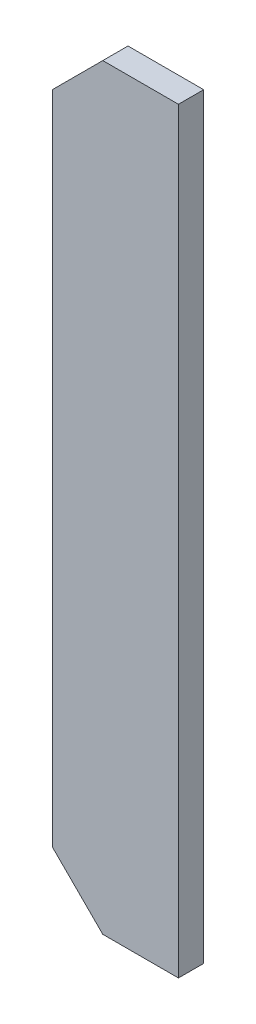
ISO-10303-21;
HEADER;
FILE_DESCRIPTION(('STEP AP214'),'2;1');
FILE_NAME('part.step','',(''),(''),'','','');
FILE_SCHEMA(('AUTOMOTIVE_DESIGN { 1 0 10303 214 1 1 1 1 }'));
ENDSEC;
DATA;
#1=APPLICATION_CONTEXT('core data for automotive mechanical design processes');
#2=APPLICATION_PROTOCOL_DEFINITION('international standard','automotive_design',2000,#1);
#3=PRODUCT_CONTEXT('',#1,'mechanical');
#4=PRODUCT('Part','Part','',(#3));
#5=PRODUCT_RELATED_PRODUCT_CATEGORY('part','',(#4));
#6=PRODUCT_DEFINITION_FORMATION('','',#4);
#7=PRODUCT_DEFINITION_CONTEXT('part definition',#1,'design');
#8=PRODUCT_DEFINITION('design','',#6,#7);
#9=PRODUCT_DEFINITION_SHAPE('','',#8);
#10=(LENGTH_UNIT() NAMED_UNIT(*) SI_UNIT(.MILLI.,.METRE.));
#11=(NAMED_UNIT(*) PLANE_ANGLE_UNIT() SI_UNIT($,.RADIAN.));
#12=(NAMED_UNIT(*) SI_UNIT($,.STERADIAN.) SOLID_ANGLE_UNIT());
#13=UNCERTAINTY_MEASURE_WITH_UNIT(LENGTH_MEASURE(1.E-05),#10,'distance_accuracy_value','');
#14=(GEOMETRIC_REPRESENTATION_CONTEXT(3) GLOBAL_UNCERTAINTY_ASSIGNED_CONTEXT((#13)) GLOBAL_UNIT_ASSIGNED_CONTEXT((#10,
#11,#12)) REPRESENTATION_CONTEXT('',''));
#15=CARTESIAN_POINT('',(0.,0.,0.));
#16=DIRECTION('',(0.,0.,1.));
#17=DIRECTION('',(1.,0.,0.));
#18=AXIS2_PLACEMENT_3D('',#15,#16,#17);
#19=CARTESIAN_POINT('',(25.,0.,2.5));
#20=DIRECTION('',(0.,1.,0.));
#21=DIRECTION('',(-1.,0.,0.));
#22=AXIS2_PLACEMENT_3D('',#19,#20,#21);
#23=PLANE('',#22);
#24=DIRECTION('',(1.,0.,0.));
#25=VECTOR('',#24,1.);
#26=CARTESIAN_POINT('',(25.,0.,2.5));
#27=LINE('',#26,#25);
#28=CARTESIAN_POINT('',(9.99999999999998,0.,2.5));
#29=VERTEX_POINT('',#28);
#30=CARTESIAN_POINT('',(25.,0.,2.5));
#31=VERTEX_POINT('',#30);
#32=EDGE_CURVE('E101',#29,#31,#27,.T.);
#33=ORIENTED_EDGE('',*,*,#32,.F.);
#34=DIRECTION('',(0.,0.,-1.));
#35=VECTOR('',#34,1.);
#36=CARTESIAN_POINT('',(9.99999999999998,0.,2.5));
#37=LINE('',#36,#35);
#38=CARTESIAN_POINT('',(9.99999999999998,0.,-2.5));
#39=VERTEX_POINT('',#38);
#40=EDGE_CURVE('E127',#29,#39,#37,.T.);
#41=ORIENTED_EDGE('',*,*,#40,.T.);
#42=DIRECTION('',(1.,0.,0.));
#43=VECTOR('',#42,1.);
#44=CARTESIAN_POINT('',(25.,0.,-2.5));
#45=LINE('',#44,#43);
#46=CARTESIAN_POINT('',(25.,0.,-2.5));
#47=VERTEX_POINT('',#46);
#48=EDGE_CURVE('E124',#39,#47,#45,.T.);
#49=ORIENTED_EDGE('',*,*,#48,.T.);
#50=DIRECTION('',(0.,0.,-1.));
#51=VECTOR('',#50,1.);
#52=CARTESIAN_POINT('',(25.,0.,2.5));
#53=LINE('',#52,#51);
#54=EDGE_CURVE('E117',#31,#47,#53,.T.);
#55=ORIENTED_EDGE('',*,*,#54,.F.);
#56=EDGE_LOOP('',(#33,#41,#49,#55));
#57=FACE_BOUND('',#56,.T.);
#58=ADVANCED_FACE('F45',(#57),#23,.F.);
#59=CARTESIAN_POINT('',(25.,150.,2.5));
#60=DIRECTION('',(-1.,0.,0.));
#61=DIRECTION('',(0.,0.,1.));
#62=AXIS2_PLACEMENT_3D('',#59,#60,#61);
#63=PLANE('',#62);
#64=DIRECTION('',(0.,1.,0.));
#65=VECTOR('',#64,1.);
#66=CARTESIAN_POINT('',(25.,150.,-2.5));
#67=LINE('',#66,#65);
#68=CARTESIAN_POINT('',(25.,150.,-2.5));
#69=VERTEX_POINT('',#68);
#70=EDGE_CURVE('E173',#47,#69,#67,.T.);
#71=ORIENTED_EDGE('',*,*,#70,.T.);
#72=DIRECTION('',(0.,0.,-1.));
#73=VECTOR('',#72,1.);
#74=CARTESIAN_POINT('',(25.,150.,2.5));
#75=LINE('',#74,#73);
#76=CARTESIAN_POINT('',(25.,150.,2.5));
#77=VERTEX_POINT('',#76);
#78=EDGE_CURVE('E119',#77,#69,#75,.T.);
#79=ORIENTED_EDGE('',*,*,#78,.F.);
#80=DIRECTION('',(0.,1.,0.));
#81=VECTOR('',#80,1.);
#82=CARTESIAN_POINT('',(25.,150.,2.5));
#83=LINE('',#82,#81);
#84=EDGE_CURVE('E104',#31,#77,#83,.T.);
#85=ORIENTED_EDGE('',*,*,#84,.F.);
#86=ORIENTED_EDGE('',*,*,#54,.T.);
#87=EDGE_LOOP('',(#71,#79,#85,#86));
#88=FACE_BOUND('',#87,.T.);
#89=ADVANCED_FACE('F116',(#88),#63,.F.);
#90=CARTESIAN_POINT('',(0.,150.,2.5));
#91=DIRECTION('',(0.,-1.,0.));
#92=DIRECTION('',(0.,0.,-1.));
#93=AXIS2_PLACEMENT_3D('',#90,#91,#92);
#94=PLANE('',#93);
#95=DIRECTION('',(-1.,0.,0.));
#96=VECTOR('',#95,1.);
#97=CARTESIAN_POINT('',(0.,150.,-2.5));
#98=LINE('',#97,#96);
#99=CARTESIAN_POINT('',(10.,150.,-2.5));
#100=VERTEX_POINT('',#99);
#101=EDGE_CURVE('E170',#69,#100,#98,.T.);
#102=ORIENTED_EDGE('',*,*,#101,.T.);
#103=DIRECTION('',(0.,0.,1.));
#104=VECTOR('',#103,1.);
#105=CARTESIAN_POINT('',(10.,150.,2.5));
#106=LINE('',#105,#104);
#107=CARTESIAN_POINT('',(10.,150.,2.5));
#108=VERTEX_POINT('',#107);
#109=EDGE_CURVE('E11',#100,#108,#106,.T.);
#110=ORIENTED_EDGE('',*,*,#109,.T.);
#111=DIRECTION('',(-1.,0.,0.));
#112=VECTOR('',#111,1.);
#113=CARTESIAN_POINT('',(0.,150.,2.5));
#114=LINE('',#113,#112);
#115=EDGE_CURVE('E121',#77,#108,#114,.T.);
#116=ORIENTED_EDGE('',*,*,#115,.F.);
#117=ORIENTED_EDGE('',*,*,#78,.T.);
#118=EDGE_LOOP('',(#102,#110,#116,#117));
#119=FACE_BOUND('',#118,.T.);
#120=ADVANCED_FACE('F171',(#119),#94,.F.);
#121=CARTESIAN_POINT('',(0.,0.,2.5));
#122=DIRECTION('',(1.,0.,0.));
#123=DIRECTION('',(0.,0.,-1.));
#124=AXIS2_PLACEMENT_3D('',#121,#122,#123);
#125=PLANE('',#124);
#126=DIRECTION('',(0.,-1.,0.));
#127=VECTOR('',#126,1.);
#128=CARTESIAN_POINT('',(0.,0.,-2.5));
#129=LINE('',#128,#127);
#130=CARTESIAN_POINT('',(0.,140.,-2.5));
#131=VERTEX_POINT('',#130);
#132=CARTESIAN_POINT('',(0.,10.,-2.5));
#133=VERTEX_POINT('',#132);
#134=EDGE_CURVE('E112',#131,#133,#129,.T.);
#135=ORIENTED_EDGE('',*,*,#134,.T.);
#136=DIRECTION('',(0.,0.,1.));
#137=VECTOR('',#136,1.);
#138=CARTESIAN_POINT('',(0.,10.,2.5));
#139=LINE('',#138,#137);
#140=CARTESIAN_POINT('',(0.,10.,2.5));
#141=VERTEX_POINT('',#140);
#142=EDGE_CURVE('E68',#133,#141,#139,.T.);
#143=ORIENTED_EDGE('',*,*,#142,.T.);
#144=DIRECTION('',(0.,-1.,0.));
#145=VECTOR('',#144,1.);
#146=CARTESIAN_POINT('',(0.,0.,2.5));
#147=LINE('',#146,#145);
#148=CARTESIAN_POINT('',(0.,140.,2.5));
#149=VERTEX_POINT('',#148);
#150=EDGE_CURVE('E134',#149,#141,#147,.T.);
#151=ORIENTED_EDGE('',*,*,#150,.F.);
#152=DIRECTION('',(0.,0.,-1.));
#153=VECTOR('',#152,1.);
#154=CARTESIAN_POINT('',(0.,140.,2.5));
#155=LINE('',#154,#153);
#156=EDGE_CURVE('E143',#149,#131,#155,.T.);
#157=ORIENTED_EDGE('',*,*,#156,.T.);
#158=EDGE_LOOP('',(#135,#143,#151,#157));
#159=FACE_BOUND('',#158,.T.);
#160=ADVANCED_FACE('F163',(#159),#125,.F.);
#161=CARTESIAN_POINT('',(0.,0.,2.5));
#162=DIRECTION('',(0.,0.,-1.));
#163=DIRECTION('',(-1.,0.,0.));
#164=AXIS2_PLACEMENT_3D('',#161,#162,#163);
#165=PLANE('',#164);
#166=ORIENTED_EDGE('',*,*,#150,.T.);
#167=DIRECTION('',(-0.707106781186546,0.707106781186549,0.));
#168=VECTOR('',#167,1.);
#169=CARTESIAN_POINT('',(9.99999999999998,0.,2.5));
#170=LINE('',#169,#168);
#171=EDGE_CURVE('E55',#141,#29,#170,.F.);
#172=ORIENTED_EDGE('',*,*,#171,.T.);
#173=ORIENTED_EDGE('',*,*,#32,.T.);
#174=ORIENTED_EDGE('',*,*,#84,.T.);
#175=ORIENTED_EDGE('',*,*,#115,.T.);
#176=DIRECTION('',(0.707106781186547,0.707106781186548,0.));
#177=VECTOR('',#176,1.);
#178=CARTESIAN_POINT('',(0.,140.,2.5));
#179=LINE('',#178,#177);
#180=EDGE_CURVE('E149',#108,#149,#179,.F.);
#181=ORIENTED_EDGE('',*,*,#180,.T.);
#182=EDGE_LOOP('',(#166,#172,#173,#174,#175,#181));
#183=FACE_BOUND('',#182,.T.);
#184=ADVANCED_FACE('F103',(#183),#165,.F.);
#185=CARTESIAN_POINT('',(0.,0.,-2.5));
#186=DIRECTION('',(0.,0.,-1.));
#187=DIRECTION('',(-1.,0.,0.));
#188=AXIS2_PLACEMENT_3D('',#185,#186,#187);
#189=PLANE('',#188);
#190=ORIENTED_EDGE('',*,*,#48,.F.);
#191=DIRECTION('',(0.707106781186546,-0.707106781186549,0.));
#192=VECTOR('',#191,1.);
#193=CARTESIAN_POINT('',(5.00000000000001,4.99999999999999,-2.5));
#194=LINE('',#193,#192);
#195=EDGE_CURVE('E140',#39,#133,#194,.F.);
#196=ORIENTED_EDGE('',*,*,#195,.T.);
#197=ORIENTED_EDGE('',*,*,#134,.F.);
#198=DIRECTION('',(-0.707106781186547,-0.707106781186548,0.));
#199=VECTOR('',#198,1.);
#200=CARTESIAN_POINT('',(-70.,69.9999999999999,-2.5));
#201=LINE('',#200,#199);
#202=EDGE_CURVE('E132',#131,#100,#201,.F.);
#203=ORIENTED_EDGE('',*,*,#202,.T.);
#204=ORIENTED_EDGE('',*,*,#101,.F.);
#205=ORIENTED_EDGE('',*,*,#70,.F.);
#206=EDGE_LOOP('',(#190,#196,#197,#203,#204,#205));
#207=FACE_BOUND('',#206,.T.);
#208=ADVANCED_FACE('F169',(#207),#189,.T.);
#209=CARTESIAN_POINT('',(9.99999999999998,0.,2.5));
#210=DIRECTION('',(0.707106781186549,0.707106781186546,0.));
#211=DIRECTION('',(0.,0.,-1.));
#212=AXIS2_PLACEMENT_3D('',#209,#210,#211);
#213=PLANE('',#212);
#214=ORIENTED_EDGE('',*,*,#171,.F.);
#215=ORIENTED_EDGE('',*,*,#142,.F.);
#216=ORIENTED_EDGE('',*,*,#195,.F.);
#217=ORIENTED_EDGE('',*,*,#40,.F.);
#218=EDGE_LOOP('',(#214,#215,#216,#217));
#219=FACE_BOUND('',#218,.T.);
#220=ADVANCED_FACE('F192',(#219),#213,.F.);
#221=CARTESIAN_POINT('',(0.,140.,2.5));
#222=DIRECTION('',(0.707106781186548,-0.707106781186547,0.));
#223=DIRECTION('',(0.,0.,-1.));
#224=AXIS2_PLACEMENT_3D('',#221,#222,#223);
#225=PLANE('',#224);
#226=ORIENTED_EDGE('',*,*,#180,.F.);
#227=ORIENTED_EDGE('',*,*,#109,.F.);
#228=ORIENTED_EDGE('',*,*,#202,.F.);
#229=ORIENTED_EDGE('',*,*,#156,.F.);
#230=EDGE_LOOP('',(#226,#227,#228,#229));
#231=FACE_BOUND('',#230,.T.);
#232=ADVANCED_FACE('F48',(#231),#225,.F.);
#233=CLOSED_SHELL('',(#58,#89,#120,#160,#184,#208,#220,#232));
#234=MANIFOLD_SOLID_BREP('B2',#233);
#235=ADVANCED_BREP_SHAPE_REPRESENTATION('',(#18,#234),#14);
#236=SHAPE_DEFINITION_REPRESENTATION(#9,#235);
ENDSEC;
END-ISO-10303-21;
